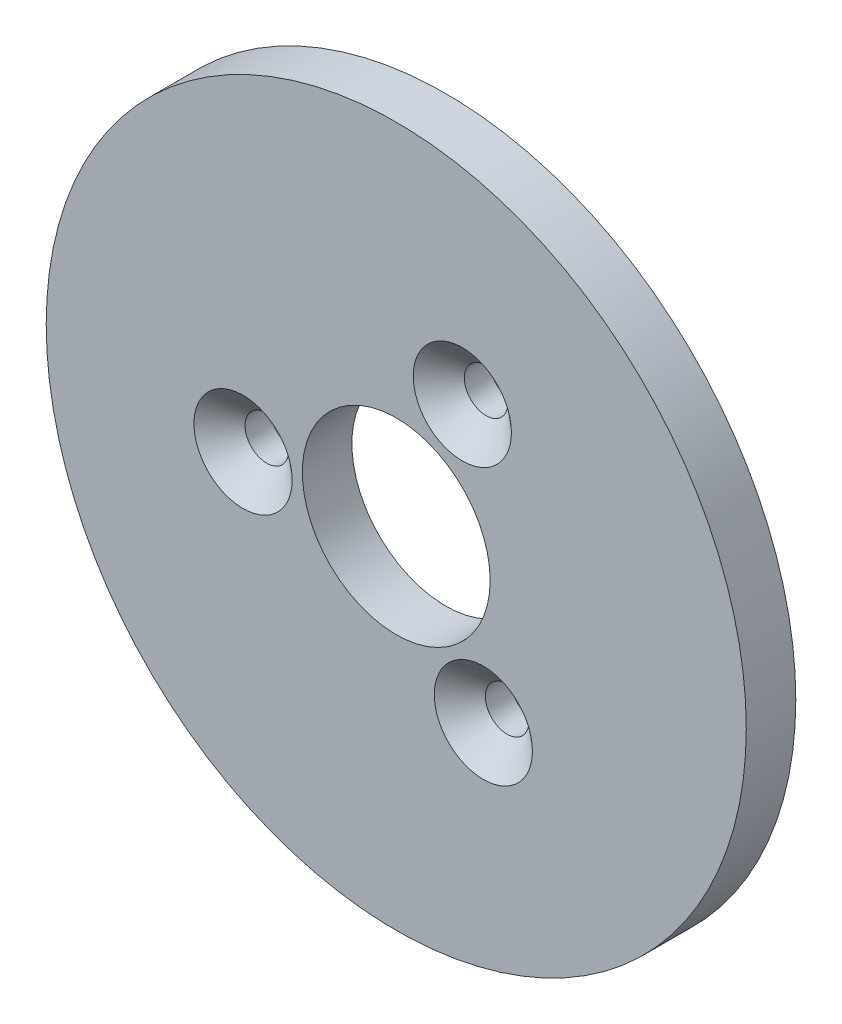
ISO-10303-21;
HEADER;
FILE_DESCRIPTION(('STEP AP214'),'2;1');
FILE_NAME('part.step','',(''),(''),'','','');
FILE_SCHEMA(('AUTOMOTIVE_DESIGN { 1 0 10303 214 1 1 1 1 }'));
ENDSEC;
DATA;
#1=APPLICATION_CONTEXT('core data for automotive mechanical design processes');
#2=APPLICATION_PROTOCOL_DEFINITION('international standard','automotive_design',2000,#1);
#3=PRODUCT_CONTEXT('',#1,'mechanical');
#4=PRODUCT('Part','Part','',(#3));
#5=PRODUCT_RELATED_PRODUCT_CATEGORY('part','',(#4));
#6=PRODUCT_DEFINITION_FORMATION('','',#4);
#7=PRODUCT_DEFINITION_CONTEXT('part definition',#1,'design');
#8=PRODUCT_DEFINITION('design','',#6,#7);
#9=PRODUCT_DEFINITION_SHAPE('','',#8);
#10=(LENGTH_UNIT() NAMED_UNIT(*) SI_UNIT(.MILLI.,.METRE.));
#11=(NAMED_UNIT(*) PLANE_ANGLE_UNIT() SI_UNIT($,.RADIAN.));
#12=(NAMED_UNIT(*) SI_UNIT($,.STERADIAN.) SOLID_ANGLE_UNIT());
#13=UNCERTAINTY_MEASURE_WITH_UNIT(LENGTH_MEASURE(1.E-05),#10,'distance_accuracy_value','');
#14=(GEOMETRIC_REPRESENTATION_CONTEXT(3) GLOBAL_UNCERTAINTY_ASSIGNED_CONTEXT((#13)) GLOBAL_UNIT_ASSIGNED_CONTEXT((#10,
#11,#12)) REPRESENTATION_CONTEXT('',''));
#15=CARTESIAN_POINT('',(0.,0.,0.));
#16=DIRECTION('',(0.,0.,1.));
#17=DIRECTION('',(1.,0.,0.));
#18=AXIS2_PLACEMENT_3D('',#15,#16,#17);
#19=CARTESIAN_POINT('',(0.,0.,2.9));
#20=DIRECTION('',(0.,0.,-1.));
#21=DIRECTION('',(-1.,0.,0.));
#22=AXIS2_PLACEMENT_3D('',#19,#20,#21);
#23=CYLINDRICAL_SURFACE('',#22,20.5);
#24=CARTESIAN_POINT('',(0.,0.,2.9));
#25=DIRECTION('',(0.,0.,1.));
#26=DIRECTION('',(1.,0.,0.));
#27=AXIS2_PLACEMENT_3D('',#24,#25,#26);
#28=CIRCLE('',#27,20.5);
#29=CARTESIAN_POINT('',(20.5,0.,2.9));
#30=VERTEX_POINT('',#29);
#31=EDGE_CURVE('E56',#30,#30,#28,.T.);
#32=ORIENTED_EDGE('',*,*,#31,.F.);
#33=EDGE_LOOP('',(#32));
#34=FACE_BOUND('',#33,.T.);
#35=CARTESIAN_POINT('',(0.,0.,0.));
#36=DIRECTION('',(0.,0.,1.));
#37=DIRECTION('',(1.,0.,0.));
#38=AXIS2_PLACEMENT_3D('',#35,#36,#37);
#39=CIRCLE('',#38,20.5);
#40=CARTESIAN_POINT('',(20.5,0.,0.));
#41=VERTEX_POINT('',#40);
#42=EDGE_CURVE('E57',#41,#41,#39,.T.);
#43=ORIENTED_EDGE('',*,*,#42,.T.);
#44=EDGE_LOOP('',(#43));
#45=FACE_BOUND('',#44,.T.);
#46=ADVANCED_FACE('F30',(#34,#45),#23,.T.);
#47=CARTESIAN_POINT('',(0.,0.,2.9));
#48=DIRECTION('',(0.,0.,1.));
#49=DIRECTION('',(1.,0.,0.));
#50=AXIS2_PLACEMENT_3D('',#47,#48,#49);
#51=PLANE('',#50);
#52=CARTESIAN_POINT('',(0.,0.,2.9));
#53=DIRECTION('',(0.,0.,1.));
#54=DIRECTION('',(1.,0.,0.));
#55=AXIS2_PLACEMENT_3D('',#52,#53,#54);
#56=CIRCLE('',#55,5.5);
#57=CARTESIAN_POINT('',(5.5,0.,2.9));
#58=VERTEX_POINT('',#57);
#59=EDGE_CURVE('E72',#58,#58,#56,.T.);
#60=ORIENTED_EDGE('',*,*,#59,.F.);
#61=EDGE_LOOP('',(#60));
#62=FACE_BOUND('',#61,.T.);
#63=CARTESIAN_POINT('',(-8.97185967817487,-0.711149713590536,2.9));
#64=DIRECTION('',(0.,0.,1.));
#65=DIRECTION('',(1.,0.,0.));
#66=AXIS2_PLACEMENT_3D('',#63,#64,#65);
#67=CIRCLE('',#66,2.87500000000001);
#68=CARTESIAN_POINT('',(-6.09685967817486,-0.711149713590536,2.9));
#69=VERTEX_POINT('',#68);
#70=EDGE_CURVE('E41',#69,#69,#67,.F.);
#71=ORIENTED_EDGE('',*,*,#70,.T.);
#72=EDGE_LOOP('',(#71));
#73=FACE_BOUND('',#72,.T.);
#74=CARTESIAN_POINT('',(3.87005612122401,8.12543325728398,2.9));
#75=DIRECTION('',(0.,0.,1.));
#76=DIRECTION('',(1.,0.,0.));
#77=AXIS2_PLACEMENT_3D('',#74,#75,#76);
#78=CIRCLE('',#77,2.87500000000001);
#79=CARTESIAN_POINT('',(6.74505612122402,8.12543325728398,2.9));
#80=VERTEX_POINT('',#79);
#81=EDGE_CURVE('E45',#80,#80,#78,.F.);
#82=ORIENTED_EDGE('',*,*,#81,.T.);
#83=EDGE_LOOP('',(#82));
#84=FACE_BOUND('',#83,.T.);
#85=CARTESIAN_POINT('',(5.10180355695086,-7.41428354369345,2.9));
#86=DIRECTION('',(0.,0.,1.));
#87=DIRECTION('',(1.,0.,0.));
#88=AXIS2_PLACEMENT_3D('',#85,#86,#87);
#89=CIRCLE('',#88,2.87500000000001);
#90=CARTESIAN_POINT('',(7.97680355695087,-7.41428354369345,2.9));
#91=VERTEX_POINT('',#90);
#92=EDGE_CURVE('E50',#91,#91,#89,.F.);
#93=ORIENTED_EDGE('',*,*,#92,.T.);
#94=EDGE_LOOP('',(#93));
#95=FACE_BOUND('',#94,.T.);
#96=ORIENTED_EDGE('',*,*,#31,.T.);
#97=EDGE_LOOP('',(#96));
#98=FACE_BOUND('',#97,.T.);
#99=ADVANCED_FACE('F87',(#62,#73,#84,#95,#98),#51,.T.);
#100=CARTESIAN_POINT('',(0.,0.,0.));
#101=DIRECTION('',(0.,0.,1.));
#102=DIRECTION('',(1.,0.,0.));
#103=AXIS2_PLACEMENT_3D('',#100,#101,#102);
#104=PLANE('',#103);
#105=CARTESIAN_POINT('',(0.,0.,0.));
#106=DIRECTION('',(0.,0.,1.));
#107=DIRECTION('',(1.,0.,0.));
#108=AXIS2_PLACEMENT_3D('',#105,#106,#107);
#109=CIRCLE('',#108,5.5);
#110=CARTESIAN_POINT('',(5.5,0.,0.));
#111=VERTEX_POINT('',#110);
#112=EDGE_CURVE('E69',#111,#111,#109,.T.);
#113=ORIENTED_EDGE('',*,*,#112,.T.);
#114=EDGE_LOOP('',(#113));
#115=FACE_BOUND('',#114,.T.);
#116=CARTESIAN_POINT('',(5.10180355695086,-7.41428354369345,0.));
#117=DIRECTION('',(0.,0.,1.));
#118=DIRECTION('',(1.,0.,0.));
#119=AXIS2_PLACEMENT_3D('',#116,#117,#118);
#120=CIRCLE('',#119,1.275);
#121=CARTESIAN_POINT('',(6.37680355695086,-7.41428354369345,0.));
#122=VERTEX_POINT('',#121);
#123=EDGE_CURVE('E65',#122,#122,#120,.T.);
#124=ORIENTED_EDGE('',*,*,#123,.T.);
#125=EDGE_LOOP('',(#124));
#126=FACE_BOUND('',#125,.T.);
#127=CARTESIAN_POINT('',(3.87005612122401,8.12543325728398,0.));
#128=DIRECTION('',(0.,0.,1.));
#129=DIRECTION('',(1.,0.,0.));
#130=AXIS2_PLACEMENT_3D('',#127,#128,#129);
#131=CIRCLE('',#130,1.275);
#132=CARTESIAN_POINT('',(5.14505612122401,8.12543325728398,0.));
#133=VERTEX_POINT('',#132);
#134=EDGE_CURVE('E66',#133,#133,#131,.T.);
#135=ORIENTED_EDGE('',*,*,#134,.T.);
#136=EDGE_LOOP('',(#135));
#137=FACE_BOUND('',#136,.T.);
#138=CARTESIAN_POINT('',(-8.97185967817487,-0.711149713590536,0.));
#139=DIRECTION('',(0.,0.,1.));
#140=DIRECTION('',(1.,0.,0.));
#141=AXIS2_PLACEMENT_3D('',#138,#139,#140);
#142=CIRCLE('',#141,1.275);
#143=CARTESIAN_POINT('',(-7.69685967817487,-0.711149713590536,0.));
#144=VERTEX_POINT('',#143);
#145=EDGE_CURVE('E60',#144,#144,#142,.T.);
#146=ORIENTED_EDGE('',*,*,#145,.T.);
#147=EDGE_LOOP('',(#146));
#148=FACE_BOUND('',#147,.T.);
#149=ORIENTED_EDGE('',*,*,#42,.F.);
#150=EDGE_LOOP('',(#149));
#151=FACE_BOUND('',#150,.T.);
#152=ADVANCED_FACE('F78',(#115,#126,#137,#148,#151),#104,.F.);
#153=CARTESIAN_POINT('',(-8.97185967817487,-0.711149713590536,0.));
#154=DIRECTION('',(0.,0.,1.));
#155=DIRECTION('',(1.,0.,0.));
#156=AXIS2_PLACEMENT_3D('',#153,#154,#155);
#157=CYLINDRICAL_SURFACE('',#156,1.275);
#158=CARTESIAN_POINT('',(-8.97185967817487,-0.711149713590536,1.50914121949403));
#159=DIRECTION('',(0.,0.,1.));
#160=DIRECTION('',(1.,0.,0.));
#161=AXIS2_PLACEMENT_3D('',#158,#159,#160);
#162=CIRCLE('',#161,1.275);
#163=CARTESIAN_POINT('',(-7.69685967817487,-0.711149713590536,1.50914121949403));
#164=VERTEX_POINT('',#163);
#165=EDGE_CURVE('E53',#164,#164,#162,.T.);
#166=ORIENTED_EDGE('',*,*,#165,.T.);
#167=EDGE_LOOP('',(#166));
#168=FACE_BOUND('',#167,.T.);
#169=ORIENTED_EDGE('',*,*,#145,.F.);
#170=EDGE_LOOP('',(#169));
#171=FACE_BOUND('',#170,.T.);
#172=ADVANCED_FACE('F105',(#168,#171),#157,.F.);
#173=CARTESIAN_POINT('',(3.87005612122401,8.12543325728398,0.));
#174=DIRECTION('',(0.,0.,1.));
#175=DIRECTION('',(1.,0.,0.));
#176=AXIS2_PLACEMENT_3D('',#173,#174,#175);
#177=CYLINDRICAL_SURFACE('',#176,1.275);
#178=CARTESIAN_POINT('',(3.87005612122401,8.12543325728398,1.50914121949403));
#179=DIRECTION('',(0.,0.,1.));
#180=DIRECTION('',(1.,0.,0.));
#181=AXIS2_PLACEMENT_3D('',#178,#179,#180);
#182=CIRCLE('',#181,1.275);
#183=CARTESIAN_POINT('',(5.14505612122401,8.12543325728398,1.50914121949403));
#184=VERTEX_POINT('',#183);
#185=EDGE_CURVE('E37',#184,#184,#182,.T.);
#186=ORIENTED_EDGE('',*,*,#185,.T.);
#187=EDGE_LOOP('',(#186));
#188=FACE_BOUND('',#187,.T.);
#189=ORIENTED_EDGE('',*,*,#134,.F.);
#190=EDGE_LOOP('',(#189));
#191=FACE_BOUND('',#190,.T.);
#192=ADVANCED_FACE('F110',(#188,#191),#177,.F.);
#193=CARTESIAN_POINT('',(5.10180355695086,-7.41428354369345,0.));
#194=DIRECTION('',(0.,0.,1.));
#195=DIRECTION('',(1.,0.,0.));
#196=AXIS2_PLACEMENT_3D('',#193,#194,#195);
#197=CYLINDRICAL_SURFACE('',#196,1.275);
#198=CARTESIAN_POINT('',(5.10180355695086,-7.41428354369345,1.50914121949403));
#199=DIRECTION('',(0.,0.,1.));
#200=DIRECTION('',(1.,0.,0.));
#201=AXIS2_PLACEMENT_3D('',#198,#199,#200);
#202=CIRCLE('',#201,1.275);
#203=CARTESIAN_POINT('',(6.37680355695086,-7.41428354369345,1.50914121949403));
#204=VERTEX_POINT('',#203);
#205=EDGE_CURVE('E10',#204,#204,#202,.T.);
#206=ORIENTED_EDGE('',*,*,#205,.T.);
#207=EDGE_LOOP('',(#206));
#208=FACE_BOUND('',#207,.T.);
#209=ORIENTED_EDGE('',*,*,#123,.F.);
#210=EDGE_LOOP('',(#209));
#211=FACE_BOUND('',#210,.T.);
#212=ADVANCED_FACE('F117',(#208,#211),#197,.F.);
#213=CARTESIAN_POINT('',(-8.97185967817487,-0.711149713590536,1.50914121949403));
#214=DIRECTION('',(0.,0.,1.));
#215=DIRECTION('',(1.,0.,0.));
#216=AXIS2_PLACEMENT_3D('',#213,#214,#215);
#217=CONICAL_SURFACE('',#216,1.275,0.855211333477223);
#218=ORIENTED_EDGE('',*,*,#70,.F.);
#219=EDGE_LOOP('',(#218));
#220=FACE_BOUND('',#219,.T.);
#221=ORIENTED_EDGE('',*,*,#165,.F.);
#222=EDGE_LOOP('',(#221));
#223=FACE_BOUND('',#222,.T.);
#224=ADVANCED_FACE('F114',(#220,#223),#217,.F.);
#225=CARTESIAN_POINT('',(3.87005612122401,8.12543325728398,1.50914121949403));
#226=DIRECTION('',(0.,0.,1.));
#227=DIRECTION('',(1.,0.,0.));
#228=AXIS2_PLACEMENT_3D('',#225,#226,#227);
#229=CONICAL_SURFACE('',#228,1.275,0.855211333477223);
#230=ORIENTED_EDGE('',*,*,#81,.F.);
#231=EDGE_LOOP('',(#230));
#232=FACE_BOUND('',#231,.T.);
#233=ORIENTED_EDGE('',*,*,#185,.F.);
#234=EDGE_LOOP('',(#233));
#235=FACE_BOUND('',#234,.T.);
#236=ADVANCED_FACE('F116',(#232,#235),#229,.F.);
#237=CARTESIAN_POINT('',(5.10180355695086,-7.41428354369345,1.50914121949403));
#238=DIRECTION('',(0.,0.,1.));
#239=DIRECTION('',(1.,0.,0.));
#240=AXIS2_PLACEMENT_3D('',#237,#238,#239);
#241=CONICAL_SURFACE('',#240,1.275,0.855211333477223);
#242=ORIENTED_EDGE('',*,*,#92,.F.);
#243=EDGE_LOOP('',(#242));
#244=FACE_BOUND('',#243,.T.);
#245=ORIENTED_EDGE('',*,*,#205,.F.);
#246=EDGE_LOOP('',(#245));
#247=FACE_BOUND('',#246,.T.);
#248=ADVANCED_FACE('F32',(#244,#247),#241,.F.);
#249=CARTESIAN_POINT('',(0.,0.,0.));
#250=DIRECTION('',(0.,0.,1.));
#251=DIRECTION('',(1.,0.,0.));
#252=AXIS2_PLACEMENT_3D('',#249,#250,#251);
#253=CYLINDRICAL_SURFACE('',#252,5.5);
#254=ORIENTED_EDGE('',*,*,#112,.F.);
#255=EDGE_LOOP('',(#254));
#256=FACE_BOUND('',#255,.T.);
#257=ORIENTED_EDGE('',*,*,#59,.T.);
#258=EDGE_LOOP('',(#257));
#259=FACE_BOUND('',#258,.T.);
#260=ADVANCED_FACE('F81',(#256,#259),#253,.F.);
#261=CLOSED_SHELL('',(#46,#99,#152,#172,#192,#212,#224,#236,#248,#260));
#262=MANIFOLD_SOLID_BREP('B2',#261);
#263=ADVANCED_BREP_SHAPE_REPRESENTATION('',(#18,#262),#14);
#264=SHAPE_DEFINITION_REPRESENTATION(#9,#263);
ENDSEC;
END-ISO-10303-21;
